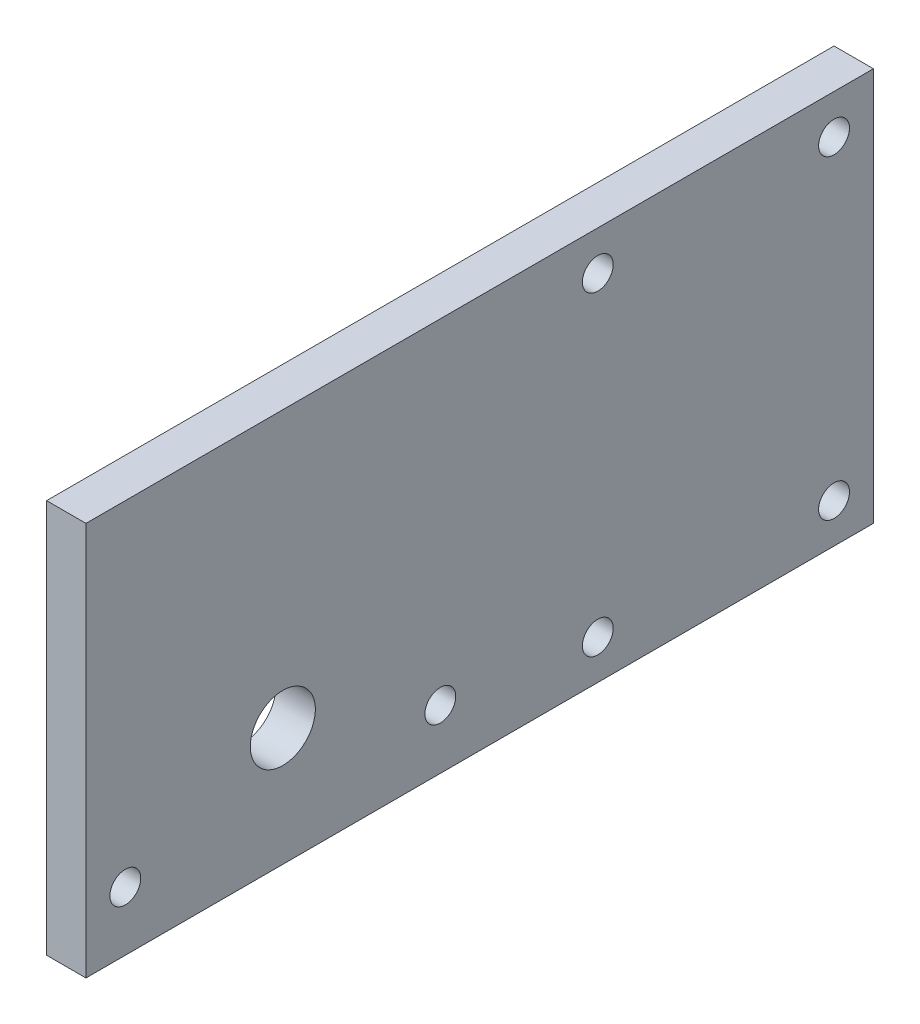
ISO-10303-21;
HEADER;
FILE_DESCRIPTION(('STEP AP214'),'2;1');
FILE_NAME('part.step','',(''),(''),'','','');
FILE_SCHEMA(('AUTOMOTIVE_DESIGN { 1 0 10303 214 1 1 1 1 }'));
ENDSEC;
DATA;
#1=APPLICATION_CONTEXT('core data for automotive mechanical design processes');
#2=APPLICATION_PROTOCOL_DEFINITION('international standard','automotive_design',2000,#1);
#3=PRODUCT_CONTEXT('',#1,'mechanical');
#4=PRODUCT('Part','Part','',(#3));
#5=PRODUCT_RELATED_PRODUCT_CATEGORY('part','',(#4));
#6=PRODUCT_DEFINITION_FORMATION('','',#4);
#7=PRODUCT_DEFINITION_CONTEXT('part definition',#1,'design');
#8=PRODUCT_DEFINITION('design','',#6,#7);
#9=PRODUCT_DEFINITION_SHAPE('','',#8);
#10=(LENGTH_UNIT() NAMED_UNIT(*) SI_UNIT(.MILLI.,.METRE.));
#11=(NAMED_UNIT(*) PLANE_ANGLE_UNIT() SI_UNIT($,.RADIAN.));
#12=(NAMED_UNIT(*) SI_UNIT($,.STERADIAN.) SOLID_ANGLE_UNIT());
#13=UNCERTAINTY_MEASURE_WITH_UNIT(LENGTH_MEASURE(1.E-05),#10,'distance_accuracy_value','');
#14=(GEOMETRIC_REPRESENTATION_CONTEXT(3) GLOBAL_UNCERTAINTY_ASSIGNED_CONTEXT((#13)) GLOBAL_UNIT_ASSIGNED_CONTEXT((#10,
#11,#12)) REPRESENTATION_CONTEXT('',''));
#15=CARTESIAN_POINT('',(0.,0.,0.));
#16=DIRECTION('',(0.,0.,1.));
#17=DIRECTION('',(1.,0.,0.));
#18=AXIS2_PLACEMENT_3D('',#15,#16,#17);
#19=CARTESIAN_POINT('',(6.35,-31.75,-63.5));
#20=DIRECTION('',(0.,0.,1.));
#21=DIRECTION('',(1.,0.,0.));
#22=AXIS2_PLACEMENT_3D('',#19,#20,#21);
#23=PLANE('',#22);
#24=DIRECTION('',(0.,1.,0.));
#25=VECTOR('',#24,1.);
#26=CARTESIAN_POINT('',(0.,-31.75,-63.5));
#27=LINE('',#26,#25);
#28=CARTESIAN_POINT('',(0.,-31.75,-63.5));
#29=VERTEX_POINT('',#28);
#30=CARTESIAN_POINT('',(0.,31.75,-63.5));
#31=VERTEX_POINT('',#30);
#32=EDGE_CURVE('E98',#29,#31,#27,.T.);
#33=ORIENTED_EDGE('',*,*,#32,.T.);
#34=DIRECTION('',(-1.,0.,0.));
#35=VECTOR('',#34,1.);
#36=CARTESIAN_POINT('',(6.35,31.75,-63.5));
#37=LINE('',#36,#35);
#38=CARTESIAN_POINT('',(6.35,31.75,-63.5));
#39=VERTEX_POINT('',#38);
#40=EDGE_CURVE('E11',#39,#31,#37,.T.);
#41=ORIENTED_EDGE('',*,*,#40,.F.);
#42=DIRECTION('',(0.,1.,0.));
#43=VECTOR('',#42,1.);
#44=CARTESIAN_POINT('',(6.35,-31.75,-63.5));
#45=LINE('',#44,#43);
#46=CARTESIAN_POINT('',(6.35,-31.75,-63.5));
#47=VERTEX_POINT('',#46);
#48=EDGE_CURVE('E85',#47,#39,#45,.T.);
#49=ORIENTED_EDGE('',*,*,#48,.F.);
#50=DIRECTION('',(-1.,0.,0.));
#51=VECTOR('',#50,1.);
#52=CARTESIAN_POINT('',(6.35,-31.75,-63.5));
#53=LINE('',#52,#51);
#54=EDGE_CURVE('E94',#47,#29,#53,.T.);
#55=ORIENTED_EDGE('',*,*,#54,.T.);
#56=EDGE_LOOP('',(#33,#41,#49,#55));
#57=FACE_BOUND('',#56,.T.);
#58=ADVANCED_FACE('F33',(#57),#23,.F.);
#59=CARTESIAN_POINT('',(6.35,31.75,63.5));
#60=DIRECTION('',(0.,-1.,0.));
#61=DIRECTION('',(0.,0.,-1.));
#62=AXIS2_PLACEMENT_3D('',#59,#60,#61);
#63=PLANE('',#62);
#64=DIRECTION('',(0.,0.,1.));
#65=VECTOR('',#64,1.);
#66=CARTESIAN_POINT('',(0.,31.75,63.5));
#67=LINE('',#66,#65);
#68=CARTESIAN_POINT('',(0.,31.75,63.5));
#69=VERTEX_POINT('',#68);
#70=EDGE_CURVE('E89',#31,#69,#67,.T.);
#71=ORIENTED_EDGE('',*,*,#70,.T.);
#72=DIRECTION('',(-1.,0.,0.));
#73=VECTOR('',#72,1.);
#74=CARTESIAN_POINT('',(6.35,31.75,63.5));
#75=LINE('',#74,#73);
#76=CARTESIAN_POINT('',(6.35,31.75,63.5));
#77=VERTEX_POINT('',#76);
#78=EDGE_CURVE('E42',#77,#69,#75,.T.);
#79=ORIENTED_EDGE('',*,*,#78,.F.);
#80=DIRECTION('',(0.,0.,1.));
#81=VECTOR('',#80,1.);
#82=CARTESIAN_POINT('',(6.35,31.75,63.5));
#83=LINE('',#82,#81);
#84=EDGE_CURVE('E80',#39,#77,#83,.T.);
#85=ORIENTED_EDGE('',*,*,#84,.F.);
#86=ORIENTED_EDGE('',*,*,#40,.T.);
#87=EDGE_LOOP('',(#71,#79,#85,#86));
#88=FACE_BOUND('',#87,.T.);
#89=ADVANCED_FACE('F88',(#88),#63,.F.);
#90=CARTESIAN_POINT('',(6.35,-31.75,63.5));
#91=DIRECTION('',(0.,0.,-1.));
#92=DIRECTION('',(-1.,0.,0.));
#93=AXIS2_PLACEMENT_3D('',#90,#91,#92);
#94=PLANE('',#93);
#95=DIRECTION('',(0.,-1.,0.));
#96=VECTOR('',#95,1.);
#97=CARTESIAN_POINT('',(0.,-31.75,63.5));
#98=LINE('',#97,#96);
#99=CARTESIAN_POINT('',(0.,-31.75,63.5));
#100=VERTEX_POINT('',#99);
#101=EDGE_CURVE('E67',#69,#100,#98,.T.);
#102=ORIENTED_EDGE('',*,*,#101,.T.);
#103=DIRECTION('',(-1.,0.,0.));
#104=VECTOR('',#103,1.);
#105=CARTESIAN_POINT('',(6.35,-31.75,63.5));
#106=LINE('',#105,#104);
#107=CARTESIAN_POINT('',(6.35,-31.75,63.5));
#108=VERTEX_POINT('',#107);
#109=EDGE_CURVE('E90',#108,#100,#106,.T.);
#110=ORIENTED_EDGE('',*,*,#109,.F.);
#111=DIRECTION('',(0.,-1.,0.));
#112=VECTOR('',#111,1.);
#113=CARTESIAN_POINT('',(6.35,-31.75,63.5));
#114=LINE('',#113,#112);
#115=EDGE_CURVE('E83',#77,#108,#114,.T.);
#116=ORIENTED_EDGE('',*,*,#115,.F.);
#117=ORIENTED_EDGE('',*,*,#78,.T.);
#118=EDGE_LOOP('',(#102,#110,#116,#117));
#119=FACE_BOUND('',#118,.T.);
#120=ADVANCED_FACE('F92',(#119),#94,.F.);
#121=CARTESIAN_POINT('',(6.35,-31.75,63.5));
#122=DIRECTION('',(0.,1.,0.));
#123=DIRECTION('',(0.,0.,1.));
#124=AXIS2_PLACEMENT_3D('',#121,#122,#123);
#125=PLANE('',#124);
#126=DIRECTION('',(0.,0.,-1.));
#127=VECTOR('',#126,1.);
#128=CARTESIAN_POINT('',(0.,-31.75,63.5));
#129=LINE('',#128,#127);
#130=EDGE_CURVE('E73',#100,#29,#129,.T.);
#131=ORIENTED_EDGE('',*,*,#130,.T.);
#132=ORIENTED_EDGE('',*,*,#54,.F.);
#133=DIRECTION('',(0.,0.,-1.));
#134=VECTOR('',#133,1.);
#135=CARTESIAN_POINT('',(6.35,-31.75,63.5));
#136=LINE('',#135,#134);
#137=EDGE_CURVE('E50',#108,#47,#136,.T.);
#138=ORIENTED_EDGE('',*,*,#137,.F.);
#139=ORIENTED_EDGE('',*,*,#109,.T.);
#140=EDGE_LOOP('',(#131,#132,#138,#139));
#141=FACE_BOUND('',#140,.T.);
#142=ADVANCED_FACE('F105',(#141),#125,.F.);
#143=CARTESIAN_POINT('',(6.35,0.,0.));
#144=DIRECTION('',(-1.,0.,0.));
#145=DIRECTION('',(0.,0.,1.));
#146=AXIS2_PLACEMENT_3D('',#143,#144,#145);
#147=PLANE('',#146);
#148=CARTESIAN_POINT('',(6.35,-12.7,31.75));
#149=DIRECTION('',(-1.,0.,0.));
#150=DIRECTION('',(0.,0.,1.));
#151=AXIS2_PLACEMENT_3D('',#148,#149,#150);
#152=CIRCLE('',#151,5.24509999999999);
#153=CARTESIAN_POINT('',(6.35,-12.7,36.9951));
#154=VERTEX_POINT('',#153);
#155=EDGE_CURVE('E144',#154,#154,#152,.T.);
#156=ORIENTED_EDGE('',*,*,#155,.T.);
#157=EDGE_LOOP('',(#156));
#158=FACE_BOUND('',#157,.T.);
#159=CARTESIAN_POINT('',(6.35,-25.4,-57.15));
#160=DIRECTION('',(-1.,0.,0.));
#161=DIRECTION('',(0.,0.,1.));
#162=AXIS2_PLACEMENT_3D('',#159,#160,#161);
#163=CIRCLE('',#162,2.48919999999999);
#164=CARTESIAN_POINT('',(6.35,-25.4,-54.6608));
#165=VERTEX_POINT('',#164);
#166=EDGE_CURVE('E138',#165,#165,#163,.T.);
#167=ORIENTED_EDGE('',*,*,#166,.T.);
#168=EDGE_LOOP('',(#167));
#169=FACE_BOUND('',#168,.T.);
#170=CARTESIAN_POINT('',(6.35,-25.4,-19.05));
#171=DIRECTION('',(-1.,0.,0.));
#172=DIRECTION('',(0.,0.,1.));
#173=AXIS2_PLACEMENT_3D('',#170,#171,#172);
#174=CIRCLE('',#173,2.48919999999998);
#175=CARTESIAN_POINT('',(6.35,-25.4,-16.5608));
#176=VERTEX_POINT('',#175);
#177=EDGE_CURVE('E132',#176,#176,#174,.T.);
#178=ORIENTED_EDGE('',*,*,#177,.T.);
#179=EDGE_LOOP('',(#178));
#180=FACE_BOUND('',#179,.T.);
#181=CARTESIAN_POINT('',(6.35,25.4,-19.05));
#182=DIRECTION('',(-1.,0.,0.));
#183=DIRECTION('',(0.,0.,1.));
#184=AXIS2_PLACEMENT_3D('',#181,#182,#183);
#185=CIRCLE('',#184,2.48919999999998);
#186=CARTESIAN_POINT('',(6.35,25.4,-16.5608));
#187=VERTEX_POINT('',#186);
#188=EDGE_CURVE('E126',#187,#187,#185,.T.);
#189=ORIENTED_EDGE('',*,*,#188,.T.);
#190=EDGE_LOOP('',(#189));
#191=FACE_BOUND('',#190,.T.);
#192=CARTESIAN_POINT('',(6.35,25.4,-57.15));
#193=DIRECTION('',(-1.,0.,0.));
#194=DIRECTION('',(0.,0.,1.));
#195=AXIS2_PLACEMENT_3D('',#192,#193,#194);
#196=CIRCLE('',#195,2.48919999999999);
#197=CARTESIAN_POINT('',(6.35,25.4,-54.6608));
#198=VERTEX_POINT('',#197);
#199=EDGE_CURVE('E120',#198,#198,#196,.T.);
#200=ORIENTED_EDGE('',*,*,#199,.T.);
#201=EDGE_LOOP('',(#200));
#202=FACE_BOUND('',#201,.T.);
#203=CARTESIAN_POINT('',(6.35,-22.225,57.15));
#204=DIRECTION('',(-1.,0.,0.));
#205=DIRECTION('',(0.,0.,1.));
#206=AXIS2_PLACEMENT_3D('',#203,#204,#205);
#207=CIRCLE('',#206,2.48919999999999);
#208=CARTESIAN_POINT('',(6.35,-22.225,59.6392));
#209=VERTEX_POINT('',#208);
#210=EDGE_CURVE('E114',#209,#209,#207,.T.);
#211=ORIENTED_EDGE('',*,*,#210,.T.);
#212=EDGE_LOOP('',(#211));
#213=FACE_BOUND('',#212,.T.);
#214=CARTESIAN_POINT('',(6.35,-22.225,6.35000000000003));
#215=DIRECTION('',(-1.,0.,0.));
#216=DIRECTION('',(0.,0.,1.));
#217=AXIS2_PLACEMENT_3D('',#214,#215,#216);
#218=CIRCLE('',#217,2.48919999999999);
#219=CARTESIAN_POINT('',(6.35,-22.225,8.83920000000002));
#220=VERTEX_POINT('',#219);
#221=EDGE_CURVE('E36',#220,#220,#218,.T.);
#222=ORIENTED_EDGE('',*,*,#221,.T.);
#223=EDGE_LOOP('',(#222));
#224=FACE_BOUND('',#223,.T.);
#225=ORIENTED_EDGE('',*,*,#48,.T.);
#226=ORIENTED_EDGE('',*,*,#84,.T.);
#227=ORIENTED_EDGE('',*,*,#115,.T.);
#228=ORIENTED_EDGE('',*,*,#137,.T.);
#229=EDGE_LOOP('',(#225,#226,#227,#228));
#230=FACE_BOUND('',#229,.T.);
#231=ADVANCED_FACE('F81',(#158,#169,#180,#191,#202,#213,#224,#230),#147,.F.);
#232=CARTESIAN_POINT('',(0.,0.,0.));
#233=DIRECTION('',(-1.,0.,0.));
#234=DIRECTION('',(0.,0.,1.));
#235=AXIS2_PLACEMENT_3D('',#232,#233,#234);
#236=PLANE('',#235);
#237=CARTESIAN_POINT('',(0.,-12.7,31.75));
#238=DIRECTION('',(-1.,0.,0.));
#239=DIRECTION('',(0.,0.,1.));
#240=AXIS2_PLACEMENT_3D('',#237,#238,#239);
#241=CIRCLE('',#240,5.24509999999999);
#242=CARTESIAN_POINT('',(0.,-12.7,36.9951));
#243=VERTEX_POINT('',#242);
#244=EDGE_CURVE('E147',#243,#243,#241,.T.);
#245=ORIENTED_EDGE('',*,*,#244,.F.);
#246=EDGE_LOOP('',(#245));
#247=FACE_BOUND('',#246,.T.);
#248=CARTESIAN_POINT('',(0.,-25.4,-57.15));
#249=DIRECTION('',(-1.,0.,0.));
#250=DIRECTION('',(0.,0.,1.));
#251=AXIS2_PLACEMENT_3D('',#248,#249,#250);
#252=CIRCLE('',#251,2.48919999999999);
#253=CARTESIAN_POINT('',(0.,-25.4,-54.6608));
#254=VERTEX_POINT('',#253);
#255=EDGE_CURVE('E141',#254,#254,#252,.T.);
#256=ORIENTED_EDGE('',*,*,#255,.F.);
#257=EDGE_LOOP('',(#256));
#258=FACE_BOUND('',#257,.T.);
#259=CARTESIAN_POINT('',(0.,-25.4,-19.05));
#260=DIRECTION('',(-1.,0.,0.));
#261=DIRECTION('',(0.,0.,1.));
#262=AXIS2_PLACEMENT_3D('',#259,#260,#261);
#263=CIRCLE('',#262,2.48919999999999);
#264=CARTESIAN_POINT('',(0.,-25.4,-16.5608));
#265=VERTEX_POINT('',#264);
#266=EDGE_CURVE('E135',#265,#265,#263,.T.);
#267=ORIENTED_EDGE('',*,*,#266,.F.);
#268=EDGE_LOOP('',(#267));
#269=FACE_BOUND('',#268,.T.);
#270=CARTESIAN_POINT('',(0.,25.4,-19.05));
#271=DIRECTION('',(-1.,0.,0.));
#272=DIRECTION('',(0.,0.,1.));
#273=AXIS2_PLACEMENT_3D('',#270,#271,#272);
#274=CIRCLE('',#273,2.48919999999999);
#275=CARTESIAN_POINT('',(0.,25.4,-16.5608));
#276=VERTEX_POINT('',#275);
#277=EDGE_CURVE('E129',#276,#276,#274,.T.);
#278=ORIENTED_EDGE('',*,*,#277,.F.);
#279=EDGE_LOOP('',(#278));
#280=FACE_BOUND('',#279,.T.);
#281=CARTESIAN_POINT('',(0.,25.4,-57.15));
#282=DIRECTION('',(-1.,0.,0.));
#283=DIRECTION('',(0.,0.,1.));
#284=AXIS2_PLACEMENT_3D('',#281,#282,#283);
#285=CIRCLE('',#284,2.48919999999999);
#286=CARTESIAN_POINT('',(0.,25.4,-54.6608));
#287=VERTEX_POINT('',#286);
#288=EDGE_CURVE('E123',#287,#287,#285,.T.);
#289=ORIENTED_EDGE('',*,*,#288,.F.);
#290=EDGE_LOOP('',(#289));
#291=FACE_BOUND('',#290,.T.);
#292=CARTESIAN_POINT('',(0.,-22.225,57.15));
#293=DIRECTION('',(-1.,0.,0.));
#294=DIRECTION('',(0.,0.,1.));
#295=AXIS2_PLACEMENT_3D('',#292,#293,#294);
#296=CIRCLE('',#295,2.48919999999999);
#297=CARTESIAN_POINT('',(0.,-22.225,59.6392));
#298=VERTEX_POINT('',#297);
#299=EDGE_CURVE('E117',#298,#298,#296,.T.);
#300=ORIENTED_EDGE('',*,*,#299,.F.);
#301=EDGE_LOOP('',(#300));
#302=FACE_BOUND('',#301,.T.);
#303=CARTESIAN_POINT('',(0.,-22.225,6.35000000000003));
#304=DIRECTION('',(-1.,0.,0.));
#305=DIRECTION('',(0.,0.,1.));
#306=AXIS2_PLACEMENT_3D('',#303,#304,#305);
#307=CIRCLE('',#306,2.48919999999999);
#308=CARTESIAN_POINT('',(0.,-22.225,8.83920000000002));
#309=VERTEX_POINT('',#308);
#310=EDGE_CURVE('E111',#309,#309,#307,.T.);
#311=ORIENTED_EDGE('',*,*,#310,.F.);
#312=EDGE_LOOP('',(#311));
#313=FACE_BOUND('',#312,.T.);
#314=ORIENTED_EDGE('',*,*,#32,.F.);
#315=ORIENTED_EDGE('',*,*,#130,.F.);
#316=ORIENTED_EDGE('',*,*,#101,.F.);
#317=ORIENTED_EDGE('',*,*,#70,.F.);
#318=EDGE_LOOP('',(#314,#315,#316,#317));
#319=FACE_BOUND('',#318,.T.);
#320=ADVANCED_FACE('F108',(#247,#258,#269,#280,#291,#302,#313,#319),#236,.T.);
#321=CARTESIAN_POINT('',(0.,-22.225,6.35000000000003));
#322=DIRECTION('',(-1.,0.,0.));
#323=DIRECTION('',(0.,0.,1.));
#324=AXIS2_PLACEMENT_3D('',#321,#322,#323);
#325=CYLINDRICAL_SURFACE('',#324,2.48919999999999);
#326=ORIENTED_EDGE('',*,*,#310,.T.);
#327=EDGE_LOOP('',(#326));
#328=FACE_BOUND('',#327,.T.);
#329=ORIENTED_EDGE('',*,*,#221,.F.);
#330=EDGE_LOOP('',(#329));
#331=FACE_BOUND('',#330,.T.);
#332=ADVANCED_FACE('F156',(#328,#331),#325,.F.);
#333=CARTESIAN_POINT('',(0.,-22.225,57.15));
#334=DIRECTION('',(-1.,0.,0.));
#335=DIRECTION('',(0.,0.,1.));
#336=AXIS2_PLACEMENT_3D('',#333,#334,#335);
#337=CYLINDRICAL_SURFACE('',#336,2.48919999999999);
#338=ORIENTED_EDGE('',*,*,#299,.T.);
#339=EDGE_LOOP('',(#338));
#340=FACE_BOUND('',#339,.T.);
#341=ORIENTED_EDGE('',*,*,#210,.F.);
#342=EDGE_LOOP('',(#341));
#343=FACE_BOUND('',#342,.T.);
#344=ADVANCED_FACE('F172',(#340,#343),#337,.F.);
#345=CARTESIAN_POINT('',(0.,25.4,-57.15));
#346=DIRECTION('',(-1.,0.,0.));
#347=DIRECTION('',(0.,0.,1.));
#348=AXIS2_PLACEMENT_3D('',#345,#346,#347);
#349=CYLINDRICAL_SURFACE('',#348,2.48919999999999);
#350=ORIENTED_EDGE('',*,*,#288,.T.);
#351=EDGE_LOOP('',(#350));
#352=FACE_BOUND('',#351,.T.);
#353=ORIENTED_EDGE('',*,*,#199,.F.);
#354=EDGE_LOOP('',(#353));
#355=FACE_BOUND('',#354,.T.);
#356=ADVANCED_FACE('F221',(#352,#355),#349,.F.);
#357=CARTESIAN_POINT('',(0.,25.4,-19.05));
#358=DIRECTION('',(-1.,0.,0.));
#359=DIRECTION('',(0.,0.,1.));
#360=AXIS2_PLACEMENT_3D('',#357,#358,#359);
#361=CYLINDRICAL_SURFACE('',#360,2.48919999999998);
#362=ORIENTED_EDGE('',*,*,#277,.T.);
#363=EDGE_LOOP('',(#362));
#364=FACE_BOUND('',#363,.T.);
#365=ORIENTED_EDGE('',*,*,#188,.F.);
#366=EDGE_LOOP('',(#365));
#367=FACE_BOUND('',#366,.T.);
#368=ADVANCED_FACE('F229',(#364,#367),#361,.F.);
#369=CARTESIAN_POINT('',(0.,-25.4,-19.05));
#370=DIRECTION('',(-1.,0.,0.));
#371=DIRECTION('',(0.,0.,1.));
#372=AXIS2_PLACEMENT_3D('',#369,#370,#371);
#373=CYLINDRICAL_SURFACE('',#372,2.48919999999998);
#374=ORIENTED_EDGE('',*,*,#266,.T.);
#375=EDGE_LOOP('',(#374));
#376=FACE_BOUND('',#375,.T.);
#377=ORIENTED_EDGE('',*,*,#177,.F.);
#378=EDGE_LOOP('',(#377));
#379=FACE_BOUND('',#378,.T.);
#380=ADVANCED_FACE('F237',(#376,#379),#373,.F.);
#381=CARTESIAN_POINT('',(0.,-25.4,-57.15));
#382=DIRECTION('',(-1.,0.,0.));
#383=DIRECTION('',(0.,0.,1.));
#384=AXIS2_PLACEMENT_3D('',#381,#382,#383);
#385=CYLINDRICAL_SURFACE('',#384,2.48919999999999);
#386=ORIENTED_EDGE('',*,*,#255,.T.);
#387=EDGE_LOOP('',(#386));
#388=FACE_BOUND('',#387,.T.);
#389=ORIENTED_EDGE('',*,*,#166,.F.);
#390=EDGE_LOOP('',(#389));
#391=FACE_BOUND('',#390,.T.);
#392=ADVANCED_FACE('F245',(#388,#391),#385,.F.);
#393=CARTESIAN_POINT('',(0.,-12.7,31.75));
#394=DIRECTION('',(-1.,0.,0.));
#395=DIRECTION('',(0.,0.,1.));
#396=AXIS2_PLACEMENT_3D('',#393,#394,#395);
#397=CYLINDRICAL_SURFACE('',#396,5.24509999999999);
#398=ORIENTED_EDGE('',*,*,#244,.T.);
#399=EDGE_LOOP('',(#398));
#400=FACE_BOUND('',#399,.T.);
#401=ORIENTED_EDGE('',*,*,#155,.F.);
#402=EDGE_LOOP('',(#401));
#403=FACE_BOUND('',#402,.T.);
#404=ADVANCED_FACE('F151',(#400,#403),#397,.F.);
#405=CLOSED_SHELL('',(#58,#89,#120,#142,#231,#320,#332,#344,#356,#368,#380,#392,#404));
#406=MANIFOLD_SOLID_BREP('B2',#405);
#407=ADVANCED_BREP_SHAPE_REPRESENTATION('',(#18,#406),#14);
#408=SHAPE_DEFINITION_REPRESENTATION(#9,#407);
ENDSEC;
END-ISO-10303-21;
